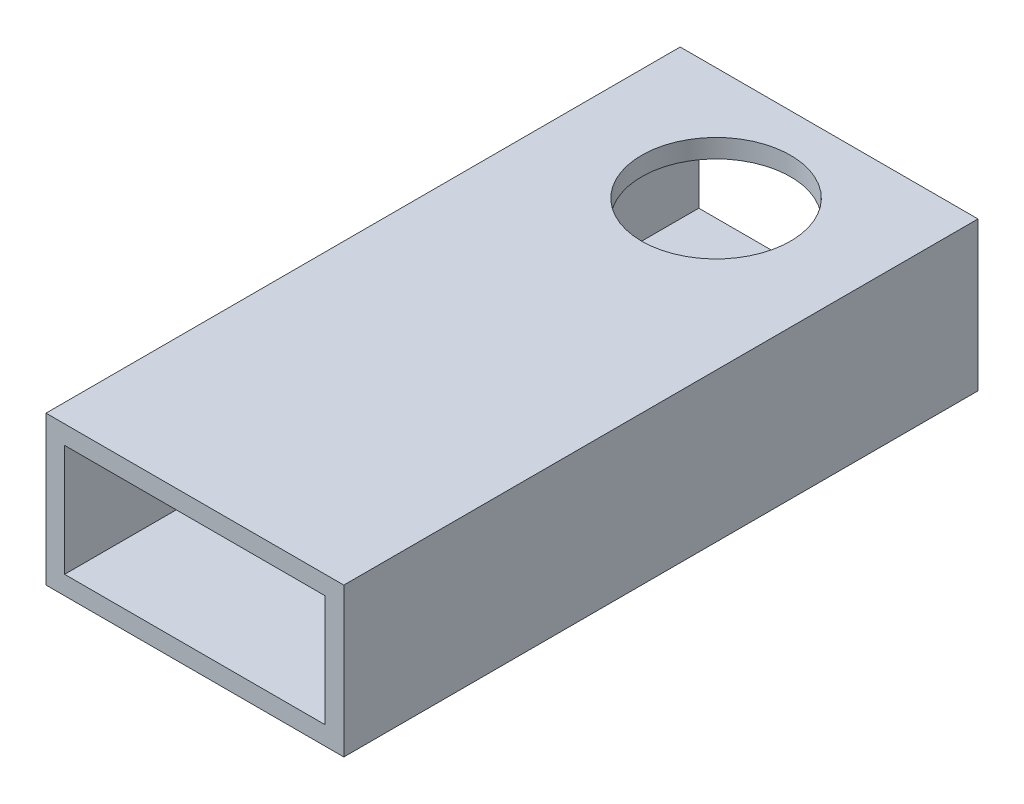
ISO-10303-21;
HEADER;
FILE_DESCRIPTION(('STEP AP214'),'2;1');
FILE_NAME('part.step','',(''),(''),'','','');
FILE_SCHEMA(('AUTOMOTIVE_DESIGN { 1 0 10303 214 1 1 1 1 }'));
ENDSEC;
DATA;
#1=APPLICATION_CONTEXT('core data for automotive mechanical design processes');
#2=APPLICATION_PROTOCOL_DEFINITION('international standard','automotive_design',2000,#1);
#3=PRODUCT_CONTEXT('',#1,'mechanical');
#4=PRODUCT('Part','Part','',(#3));
#5=PRODUCT_RELATED_PRODUCT_CATEGORY('part','',(#4));
#6=PRODUCT_DEFINITION_FORMATION('','',#4);
#7=PRODUCT_DEFINITION_CONTEXT('part definition',#1,'design');
#8=PRODUCT_DEFINITION('design','',#6,#7);
#9=PRODUCT_DEFINITION_SHAPE('','',#8);
#10=(LENGTH_UNIT() NAMED_UNIT(*) SI_UNIT(.MILLI.,.METRE.));
#11=(NAMED_UNIT(*) PLANE_ANGLE_UNIT() SI_UNIT($,.RADIAN.));
#12=(NAMED_UNIT(*) SI_UNIT($,.STERADIAN.) SOLID_ANGLE_UNIT());
#13=UNCERTAINTY_MEASURE_WITH_UNIT(LENGTH_MEASURE(1.E-05),#10,'distance_accuracy_value','');
#14=(GEOMETRIC_REPRESENTATION_CONTEXT(3) GLOBAL_UNCERTAINTY_ASSIGNED_CONTEXT((#13)) GLOBAL_UNIT_ASSIGNED_CONTEXT((#10,
#11,#12)) REPRESENTATION_CONTEXT('',''));
#15=CARTESIAN_POINT('',(0.,0.,0.));
#16=DIRECTION('',(0.,0.,1.));
#17=DIRECTION('',(1.,0.,0.));
#18=AXIS2_PLACEMENT_3D('',#15,#16,#17);
#19=CARTESIAN_POINT('',(0.,0.,108.1786));
#20=DIRECTION('',(1.,0.,0.));
#21=DIRECTION('',(0.,0.,-1.));
#22=AXIS2_PLACEMENT_3D('',#19,#20,#21);
#23=PLANE('',#22);
#24=DIRECTION('',(0.,-1.,0.));
#25=VECTOR('',#24,1.);
#26=CARTESIAN_POINT('',(0.,0.,0.));
#27=LINE('',#26,#25);
#28=CARTESIAN_POINT('',(0.,0.,0.));
#29=VERTEX_POINT('',#28);
#30=CARTESIAN_POINT('',(0.,-25.4,0.));
#31=VERTEX_POINT('',#30);
#32=EDGE_CURVE('E135',#29,#31,#27,.T.);
#33=ORIENTED_EDGE('',*,*,#32,.T.);
#34=DIRECTION('',(0.,0.,-1.));
#35=VECTOR('',#34,1.);
#36=CARTESIAN_POINT('',(0.,-25.4,108.1786));
#37=LINE('',#36,#35);
#38=CARTESIAN_POINT('',(0.,-25.4,108.1786));
#39=VERTEX_POINT('',#38);
#40=EDGE_CURVE('E11',#39,#31,#37,.T.);
#41=ORIENTED_EDGE('',*,*,#40,.F.);
#42=DIRECTION('',(0.,-1.,0.));
#43=VECTOR('',#42,1.);
#44=CARTESIAN_POINT('',(0.,0.,108.1786));
#45=LINE('',#44,#43);
#46=CARTESIAN_POINT('',(0.,0.,108.1786));
#47=VERTEX_POINT('',#46);
#48=EDGE_CURVE('E139',#47,#39,#45,.T.);
#49=ORIENTED_EDGE('',*,*,#48,.F.);
#50=DIRECTION('',(0.,0.,-1.));
#51=VECTOR('',#50,1.);
#52=CARTESIAN_POINT('',(0.,0.,108.1786));
#53=LINE('',#52,#51);
#54=EDGE_CURVE('E149',#47,#29,#53,.T.);
#55=ORIENTED_EDGE('',*,*,#54,.T.);
#56=EDGE_LOOP('',(#33,#41,#49,#55));
#57=FACE_BOUND('',#56,.T.);
#58=ADVANCED_FACE('F33',(#57),#23,.F.);
#59=CARTESIAN_POINT('',(0.,-25.4,108.1786));
#60=DIRECTION('',(0.,1.,0.));
#61=DIRECTION('',(0.,0.,1.));
#62=AXIS2_PLACEMENT_3D('',#59,#60,#61);
#63=PLANE('',#62);
#64=CARTESIAN_POINT('',(25.4,-25.4,19.2786));
#65=DIRECTION('',(0.,-1.,0.));
#66=DIRECTION('',(0.,0.,-1.));
#67=AXIS2_PLACEMENT_3D('',#64,#65,#66);
#68=CIRCLE('',#67,6.35);
#69=CARTESIAN_POINT('',(25.4,-25.4,12.9286));
#70=VERTEX_POINT('',#69);
#71=EDGE_CURVE('E222',#70,#70,#68,.T.);
#72=ORIENTED_EDGE('',*,*,#71,.F.);
#73=EDGE_LOOP('',(#72));
#74=FACE_BOUND('',#73,.T.);
#75=DIRECTION('',(1.,0.,0.));
#76=VECTOR('',#75,1.);
#77=CARTESIAN_POINT('',(0.,-25.4,0.));
#78=LINE('',#77,#76);
#79=CARTESIAN_POINT('',(50.8,-25.4,0.));
#80=VERTEX_POINT('',#79);
#81=EDGE_CURVE('E152',#31,#80,#78,.T.);
#82=ORIENTED_EDGE('',*,*,#81,.T.);
#83=DIRECTION('',(0.,0.,-1.));
#84=VECTOR('',#83,1.);
#85=CARTESIAN_POINT('',(50.8,-25.4,108.1786));
#86=LINE('',#85,#84);
#87=CARTESIAN_POINT('',(50.8,-25.4,108.1786));
#88=VERTEX_POINT('',#87);
#89=EDGE_CURVE('E41',#88,#80,#86,.T.);
#90=ORIENTED_EDGE('',*,*,#89,.F.);
#91=DIRECTION('',(1.,0.,0.));
#92=VECTOR('',#91,1.);
#93=CARTESIAN_POINT('',(0.,-25.4,108.1786));
#94=LINE('',#93,#92);
#95=EDGE_CURVE('E142',#39,#88,#94,.T.);
#96=ORIENTED_EDGE('',*,*,#95,.F.);
#97=ORIENTED_EDGE('',*,*,#40,.T.);
#98=EDGE_LOOP('',(#82,#90,#96,#97));
#99=FACE_BOUND('',#98,.T.);
#100=ADVANCED_FACE('F181',(#74,#99),#63,.F.);
#101=CARTESIAN_POINT('',(50.8,0.,108.1786));
#102=DIRECTION('',(-1.,0.,0.));
#103=DIRECTION('',(0.,0.,1.));
#104=AXIS2_PLACEMENT_3D('',#101,#102,#103);
#105=PLANE('',#104);
#106=DIRECTION('',(0.,1.,0.));
#107=VECTOR('',#106,1.);
#108=CARTESIAN_POINT('',(50.8,0.,0.));
#109=LINE('',#108,#107);
#110=CARTESIAN_POINT('',(50.8,0.,0.));
#111=VERTEX_POINT('',#110);
#112=EDGE_CURVE('E154',#80,#111,#109,.T.);
#113=ORIENTED_EDGE('',*,*,#112,.T.);
#114=DIRECTION('',(0.,0.,-1.));
#115=VECTOR('',#114,1.);
#116=CARTESIAN_POINT('',(50.8,0.,108.1786));
#117=LINE('',#116,#115);
#118=CARTESIAN_POINT('',(50.8,0.,108.1786));
#119=VERTEX_POINT('',#118);
#120=EDGE_CURVE('E159',#119,#111,#117,.T.);
#121=ORIENTED_EDGE('',*,*,#120,.F.);
#122=DIRECTION('',(0.,1.,0.));
#123=VECTOR('',#122,1.);
#124=CARTESIAN_POINT('',(50.8,0.,108.1786));
#125=LINE('',#124,#123);
#126=EDGE_CURVE('E145',#88,#119,#125,.T.);
#127=ORIENTED_EDGE('',*,*,#126,.F.);
#128=ORIENTED_EDGE('',*,*,#89,.T.);
#129=EDGE_LOOP('',(#113,#121,#127,#128));
#130=FACE_BOUND('',#129,.T.);
#131=ADVANCED_FACE('F167',(#130),#105,.F.);
#132=CARTESIAN_POINT('',(0.,0.,108.1786));
#133=DIRECTION('',(0.,-1.,0.));
#134=DIRECTION('',(0.,0.,-1.));
#135=AXIS2_PLACEMENT_3D('',#132,#133,#134);
#136=PLANE('',#135);
#137=CARTESIAN_POINT('',(25.4,0.,19.2786));
#138=DIRECTION('',(0.,1.,0.));
#139=DIRECTION('',(0.,0.,1.));
#140=AXIS2_PLACEMENT_3D('',#137,#138,#139);
#141=CIRCLE('',#140,12.7);
#142=CARTESIAN_POINT('',(25.4,0.,31.9786));
#143=VERTEX_POINT('',#142);
#144=EDGE_CURVE('E122',#143,#143,#141,.T.);
#145=ORIENTED_EDGE('',*,*,#144,.F.);
#146=EDGE_LOOP('',(#145));
#147=FACE_BOUND('',#146,.T.);
#148=DIRECTION('',(-1.,0.,0.));
#149=VECTOR('',#148,1.);
#150=CARTESIAN_POINT('',(0.,0.,0.));
#151=LINE('',#150,#149);
#152=EDGE_CURVE('E143',#111,#29,#151,.T.);
#153=ORIENTED_EDGE('',*,*,#152,.T.);
#154=ORIENTED_EDGE('',*,*,#54,.F.);
#155=DIRECTION('',(-1.,0.,0.));
#156=VECTOR('',#155,1.);
#157=CARTESIAN_POINT('',(0.,0.,108.1786));
#158=LINE('',#157,#156);
#159=EDGE_CURVE('E147',#119,#47,#158,.T.);
#160=ORIENTED_EDGE('',*,*,#159,.F.);
#161=ORIENTED_EDGE('',*,*,#120,.T.);
#162=EDGE_LOOP('',(#153,#154,#160,#161));
#163=FACE_BOUND('',#162,.T.);
#164=ADVANCED_FACE('F174',(#147,#163),#136,.F.);
#165=CARTESIAN_POINT('',(0.,0.,108.1786));
#166=DIRECTION('',(0.,0.,1.));
#167=DIRECTION('',(1.,0.,0.));
#168=AXIS2_PLACEMENT_3D('',#165,#166,#167);
#169=PLANE('',#168);
#170=DIRECTION('',(0.,-1.,0.));
#171=VECTOR('',#170,1.);
#172=CARTESIAN_POINT('',(3.175,-3.175,108.1786));
#173=LINE('',#172,#171);
#174=CARTESIAN_POINT('',(3.175,-3.175,108.1786));
#175=VERTEX_POINT('',#174);
#176=CARTESIAN_POINT('',(3.175,-22.225,108.1786));
#177=VERTEX_POINT('',#176);
#178=EDGE_CURVE('E48',#175,#177,#173,.T.);
#179=ORIENTED_EDGE('',*,*,#178,.F.);
#180=DIRECTION('',(-1.,0.,0.));
#181=VECTOR('',#180,1.);
#182=CARTESIAN_POINT('',(3.175,-3.175,108.1786));
#183=LINE('',#182,#181);
#184=CARTESIAN_POINT('',(47.625,-3.175,108.1786));
#185=VERTEX_POINT('',#184);
#186=EDGE_CURVE('E116',#185,#175,#183,.T.);
#187=ORIENTED_EDGE('',*,*,#186,.F.);
#188=DIRECTION('',(0.,1.,0.));
#189=VECTOR('',#188,1.);
#190=CARTESIAN_POINT('',(47.625,-3.175,108.1786));
#191=LINE('',#190,#189);
#192=CARTESIAN_POINT('',(47.625,-22.225,108.1786));
#193=VERTEX_POINT('',#192);
#194=EDGE_CURVE('E119',#193,#185,#191,.T.);
#195=ORIENTED_EDGE('',*,*,#194,.F.);
#196=DIRECTION('',(1.,0.,0.));
#197=VECTOR('',#196,1.);
#198=CARTESIAN_POINT('',(3.175,-22.225,108.1786));
#199=LINE('',#198,#197);
#200=EDGE_CURVE('E128',#177,#193,#199,.T.);
#201=ORIENTED_EDGE('',*,*,#200,.F.);
#202=EDGE_LOOP('',(#179,#187,#195,#201));
#203=FACE_BOUND('',#202,.T.);
#204=ORIENTED_EDGE('',*,*,#48,.T.);
#205=ORIENTED_EDGE('',*,*,#95,.T.);
#206=ORIENTED_EDGE('',*,*,#126,.T.);
#207=ORIENTED_EDGE('',*,*,#159,.T.);
#208=EDGE_LOOP('',(#204,#205,#206,#207));
#209=FACE_BOUND('',#208,.T.);
#210=ADVANCED_FACE('F180',(#203,#209),#169,.T.);
#211=CARTESIAN_POINT('',(0.,0.,0.));
#212=DIRECTION('',(0.,0.,1.));
#213=DIRECTION('',(1.,0.,0.));
#214=AXIS2_PLACEMENT_3D('',#211,#212,#213);
#215=PLANE('',#214);
#216=DIRECTION('',(-1.,0.,0.));
#217=VECTOR('',#216,1.);
#218=CARTESIAN_POINT('',(3.175,-3.175,0.));
#219=LINE('',#218,#217);
#220=CARTESIAN_POINT('',(47.625,-3.175,0.));
#221=VERTEX_POINT('',#220);
#222=CARTESIAN_POINT('',(3.175,-3.175,0.));
#223=VERTEX_POINT('',#222);
#224=EDGE_CURVE('E106',#221,#223,#219,.T.);
#225=ORIENTED_EDGE('',*,*,#224,.T.);
#226=DIRECTION('',(0.,-1.,0.));
#227=VECTOR('',#226,1.);
#228=CARTESIAN_POINT('',(3.175,-3.175,0.));
#229=LINE('',#228,#227);
#230=CARTESIAN_POINT('',(3.175,-22.225,0.));
#231=VERTEX_POINT('',#230);
#232=EDGE_CURVE('E100',#223,#231,#229,.T.);
#233=ORIENTED_EDGE('',*,*,#232,.T.);
#234=DIRECTION('',(1.,0.,0.));
#235=VECTOR('',#234,1.);
#236=CARTESIAN_POINT('',(3.175,-22.225,0.));
#237=LINE('',#236,#235);
#238=CARTESIAN_POINT('',(47.625,-22.225,0.));
#239=VERTEX_POINT('',#238);
#240=EDGE_CURVE('E109',#231,#239,#237,.T.);
#241=ORIENTED_EDGE('',*,*,#240,.T.);
#242=DIRECTION('',(0.,1.,0.));
#243=VECTOR('',#242,1.);
#244=CARTESIAN_POINT('',(47.625,-3.175,0.));
#245=LINE('',#244,#243);
#246=EDGE_CURVE('E56',#239,#221,#245,.T.);
#247=ORIENTED_EDGE('',*,*,#246,.T.);
#248=EDGE_LOOP('',(#225,#233,#241,#247));
#249=FACE_BOUND('',#248,.T.);
#250=ORIENTED_EDGE('',*,*,#32,.F.);
#251=ORIENTED_EDGE('',*,*,#152,.F.);
#252=ORIENTED_EDGE('',*,*,#112,.F.);
#253=ORIENTED_EDGE('',*,*,#81,.F.);
#254=EDGE_LOOP('',(#250,#251,#252,#253));
#255=FACE_BOUND('',#254,.T.);
#256=ADVANCED_FACE('F113',(#249,#255),#215,.F.);
#257=CARTESIAN_POINT('',(3.175,-3.175,0.));
#258=DIRECTION('',(-1.,0.,0.));
#259=DIRECTION('',(0.,-1.,0.));
#260=AXIS2_PLACEMENT_3D('',#257,#258,#259);
#261=PLANE('',#260);
#262=ORIENTED_EDGE('',*,*,#178,.T.);
#263=DIRECTION('',(0.,0.,1.));
#264=VECTOR('',#263,1.);
#265=CARTESIAN_POINT('',(3.175,-22.225,0.));
#266=LINE('',#265,#264);
#267=EDGE_CURVE('E96',#231,#177,#266,.T.);
#268=ORIENTED_EDGE('',*,*,#267,.F.);
#269=ORIENTED_EDGE('',*,*,#232,.F.);
#270=DIRECTION('',(0.,0.,1.));
#271=VECTOR('',#270,1.);
#272=CARTESIAN_POINT('',(3.175,-3.175,0.));
#273=LINE('',#272,#271);
#274=EDGE_CURVE('E133',#223,#175,#273,.T.);
#275=ORIENTED_EDGE('',*,*,#274,.T.);
#276=EDGE_LOOP('',(#262,#268,#269,#275));
#277=FACE_BOUND('',#276,.T.);
#278=ADVANCED_FACE('F98',(#277),#261,.F.);
#279=CARTESIAN_POINT('',(3.175,-3.175,0.));
#280=DIRECTION('',(0.,1.,0.));
#281=DIRECTION('',(0.,0.,1.));
#282=AXIS2_PLACEMENT_3D('',#279,#280,#281);
#283=PLANE('',#282);
#284=CARTESIAN_POINT('',(25.4,-3.175,19.2786));
#285=DIRECTION('',(0.,1.,0.));
#286=DIRECTION('',(0.,0.,1.));
#287=AXIS2_PLACEMENT_3D('',#284,#285,#286);
#288=CIRCLE('',#287,12.7);
#289=CARTESIAN_POINT('',(25.4,-3.175,31.9786));
#290=VERTEX_POINT('',#289);
#291=EDGE_CURVE('E129',#290,#290,#288,.T.);
#292=ORIENTED_EDGE('',*,*,#291,.T.);
#293=EDGE_LOOP('',(#292));
#294=FACE_BOUND('',#293,.T.);
#295=ORIENTED_EDGE('',*,*,#186,.T.);
#296=ORIENTED_EDGE('',*,*,#274,.F.);
#297=ORIENTED_EDGE('',*,*,#224,.F.);
#298=DIRECTION('',(0.,0.,1.));
#299=VECTOR('',#298,1.);
#300=CARTESIAN_POINT('',(47.625,-3.175,0.));
#301=LINE('',#300,#299);
#302=EDGE_CURVE('E136',#221,#185,#301,.T.);
#303=ORIENTED_EDGE('',*,*,#302,.T.);
#304=EDGE_LOOP('',(#295,#296,#297,#303));
#305=FACE_BOUND('',#304,.T.);
#306=ADVANCED_FACE('F201',(#294,#305),#283,.F.);
#307=CARTESIAN_POINT('',(47.625,-3.175,0.));
#308=DIRECTION('',(1.,0.,0.));
#309=DIRECTION('',(0.,0.,-1.));
#310=AXIS2_PLACEMENT_3D('',#307,#308,#309);
#311=PLANE('',#310);
#312=ORIENTED_EDGE('',*,*,#194,.T.);
#313=ORIENTED_EDGE('',*,*,#302,.F.);
#314=ORIENTED_EDGE('',*,*,#246,.F.);
#315=DIRECTION('',(0.,0.,1.));
#316=VECTOR('',#315,1.);
#317=CARTESIAN_POINT('',(47.625,-22.225,0.));
#318=LINE('',#317,#316);
#319=EDGE_CURVE('E105',#239,#193,#318,.T.);
#320=ORIENTED_EDGE('',*,*,#319,.T.);
#321=EDGE_LOOP('',(#312,#313,#314,#320));
#322=FACE_BOUND('',#321,.T.);
#323=ADVANCED_FACE('F205',(#322),#311,.F.);
#324=CARTESIAN_POINT('',(3.175,-22.225,0.));
#325=DIRECTION('',(0.,-1.,0.));
#326=DIRECTION('',(0.,0.,-1.));
#327=AXIS2_PLACEMENT_3D('',#324,#325,#326);
#328=PLANE('',#327);
#329=CARTESIAN_POINT('',(25.4,-22.225,19.2786));
#330=DIRECTION('',(0.,-1.,0.));
#331=DIRECTION('',(0.,0.,-1.));
#332=AXIS2_PLACEMENT_3D('',#329,#330,#331);
#333=CIRCLE('',#332,6.35);
#334=CARTESIAN_POINT('',(25.4,-22.225,12.9286));
#335=VERTEX_POINT('',#334);
#336=EDGE_CURVE('E36',#335,#335,#333,.T.);
#337=ORIENTED_EDGE('',*,*,#336,.T.);
#338=EDGE_LOOP('',(#337));
#339=FACE_BOUND('',#338,.T.);
#340=ORIENTED_EDGE('',*,*,#200,.T.);
#341=ORIENTED_EDGE('',*,*,#319,.F.);
#342=ORIENTED_EDGE('',*,*,#240,.F.);
#343=ORIENTED_EDGE('',*,*,#267,.T.);
#344=EDGE_LOOP('',(#340,#341,#342,#343));
#345=FACE_BOUND('',#344,.T.);
#346=ADVANCED_FACE('F110',(#339,#345),#328,.F.);
#347=CARTESIAN_POINT('',(25.4,-3.175,19.2786));
#348=DIRECTION('',(0.,1.,0.));
#349=DIRECTION('',(0.,0.,1.));
#350=AXIS2_PLACEMENT_3D('',#347,#348,#349);
#351=CYLINDRICAL_SURFACE('',#350,12.7);
#352=ORIENTED_EDGE('',*,*,#291,.F.);
#353=EDGE_LOOP('',(#352));
#354=FACE_BOUND('',#353,.T.);
#355=ORIENTED_EDGE('',*,*,#144,.T.);
#356=EDGE_LOOP('',(#355));
#357=FACE_BOUND('',#356,.T.);
#358=ADVANCED_FACE('F204',(#354,#357),#351,.F.);
#359=CARTESIAN_POINT('',(25.4,82.7786,19.2786));
#360=DIRECTION('',(0.,-1.,0.));
#361=DIRECTION('',(0.,0.,-1.));
#362=AXIS2_PLACEMENT_3D('',#359,#360,#361);
#363=CYLINDRICAL_SURFACE('',#362,6.35);
#364=ORIENTED_EDGE('',*,*,#71,.T.);
#365=EDGE_LOOP('',(#364));
#366=FACE_BOUND('',#365,.T.);
#367=ORIENTED_EDGE('',*,*,#336,.F.);
#368=EDGE_LOOP('',(#367));
#369=FACE_BOUND('',#368,.T.);
#370=ADVANCED_FACE('F214',(#366,#369),#363,.F.);
#371=CLOSED_SHELL('',(#58,#100,#131,#164,#210,#256,#278,#306,#323,#346,#358,#370));
#372=MANIFOLD_SOLID_BREP('B2',#371);
#373=ADVANCED_BREP_SHAPE_REPRESENTATION('',(#18,#372),#14);
#374=SHAPE_DEFINITION_REPRESENTATION(#9,#373);
ENDSEC;
END-ISO-10303-21;
